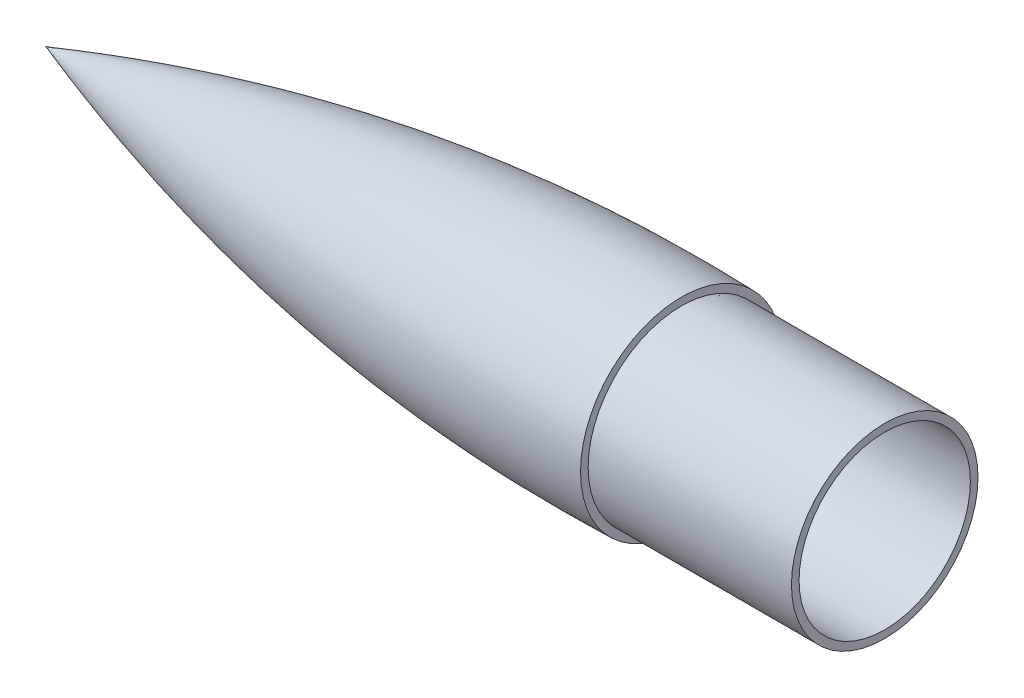
ISO-10303-21;
HEADER;
FILE_DESCRIPTION(('STEP AP214'),'2;1');
FILE_NAME('part.step','',(''),(''),'','','');
FILE_SCHEMA(('AUTOMOTIVE_DESIGN { 1 0 10303 214 1 1 1 1 }'));
ENDSEC;
DATA;
#1=APPLICATION_CONTEXT('core data for automotive mechanical design processes');
#2=APPLICATION_PROTOCOL_DEFINITION('international standard','automotive_design',2000,#1);
#3=PRODUCT_CONTEXT('',#1,'mechanical');
#4=PRODUCT('Part','Part','',(#3));
#5=PRODUCT_RELATED_PRODUCT_CATEGORY('part','',(#4));
#6=PRODUCT_DEFINITION_FORMATION('','',#4);
#7=PRODUCT_DEFINITION_CONTEXT('part definition',#1,'design');
#8=PRODUCT_DEFINITION('design','',#6,#7);
#9=PRODUCT_DEFINITION_SHAPE('','',#8);
#10=(LENGTH_UNIT() NAMED_UNIT(*) SI_UNIT(.MILLI.,.METRE.));
#11=(NAMED_UNIT(*) PLANE_ANGLE_UNIT() SI_UNIT($,.RADIAN.));
#12=(NAMED_UNIT(*) SI_UNIT($,.STERADIAN.) SOLID_ANGLE_UNIT());
#13=UNCERTAINTY_MEASURE_WITH_UNIT(LENGTH_MEASURE(1.E-05),#10,'distance_accuracy_value','');
#14=(GEOMETRIC_REPRESENTATION_CONTEXT(3) GLOBAL_UNCERTAINTY_ASSIGNED_CONTEXT((#13)) GLOBAL_UNIT_ASSIGNED_CONTEXT((#10,
#11,#12)) REPRESENTATION_CONTEXT('',''));
#15=CARTESIAN_POINT('',(0.,0.,0.));
#16=DIRECTION('',(0.,0.,1.));
#17=DIRECTION('',(1.,0.,0.));
#18=AXIS2_PLACEMENT_3D('',#15,#16,#17);
#19=CARTESIAN_POINT('',(250.000000000188,39.6996325000104,0.));
#20=CARTESIAN_POINT('',(125.000000000058,43.4661287500419,0.));
#21=CARTESIAN_POINT('',(-7.1803674117632E-11,-2.49557319254023E-11,0.));
#22=B_SPLINE_CURVE_WITH_KNOTS('',2,(#19,#20,#21),.UNSPECIFIED.,.F.,.F.,(3,3),
(0.0801802131822026,0.916380019380723),.UNSPECIFIED.);
#23=CARTESIAN_POINT('',(-5.7440163736544E-11,-1.9971871378921E-11,0.));
#24=DIRECTION('',(-1.,0.,0.));
#25=AXIS1_PLACEMENT('',#23,#24);
#26=SURFACE_OF_REVOLUTION('',#22,#25);
#27=CARTESIAN_POINT('',(0.999999999928185,0.,0.));
#28=DIRECTION('',(1.,0.,0.));
#29=DIRECTION('',(0.,0.,-1.));
#30=AXIS2_PLACEMENT_3D('',#27,#28,#29);
#31=CIRCLE('',#30,0.346973307995187);
#32=CARTESIAN_POINT('',(0.999999999928185,0.,-0.346973307995187));
#33=VERTEX_POINT('',#32);
#34=EDGE_CURVE('E88',#33,#33,#31,.T.);
#35=ORIENTED_EDGE('',*,*,#34,.T.);
#36=EDGE_LOOP('',(#35));
#37=FACE_BOUND('',#36,.T.);
#38=CARTESIAN_POINT('',(250.00000000017,-1.9971871378921E-11,0.));
#39=DIRECTION('',(-1.,0.,0.));
#40=DIRECTION('',(0.,0.,1.));
#41=AXIS2_PLACEMENT_3D('',#38,#39,#40);
#42=CIRCLE('',#41,39.6996325000309);
#43=CARTESIAN_POINT('',(250.00000000017,-1.9971871378921E-11,39.6996325000309));
#44=VERTEX_POINT('',#43);
#45=EDGE_CURVE('E91',#44,#44,#42,.T.);
#46=ORIENTED_EDGE('',*,*,#45,.T.);
#47=EDGE_LOOP('',(#46));
#48=FACE_BOUND('',#47,.T.);
#49=ADVANCED_FACE('F49',(#37,#48),#26,.T.);
#50=CARTESIAN_POINT('',(250.00000000017,-1.9971871378921E-11,0.));
#51=DIRECTION('',(-1.,0.,0.));
#52=DIRECTION('',(0.,0.,1.));
#53=AXIS2_PLACEMENT_3D('',#50,#51,#52);
#54=PLANE('',#53);
#55=CARTESIAN_POINT('',(250.00000000017,0.,0.));
#56=DIRECTION('',(-1.,0.,0.));
#57=DIRECTION('',(0.,0.,1.));
#58=AXIS2_PLACEMENT_3D('',#55,#56,#57);
#59=CIRCLE('',#58,36.699632500011);
#60=CARTESIAN_POINT('',(250.00000000017,0.,36.699632500011));
#61=VERTEX_POINT('',#60);
#62=EDGE_CURVE('E57',#61,#61,#59,.F.);
#63=ORIENTED_EDGE('',*,*,#62,.F.);
#64=EDGE_LOOP('',(#63));
#65=FACE_BOUND('',#64,.T.);
#66=ORIENTED_EDGE('',*,*,#45,.F.);
#67=EDGE_LOOP('',(#66));
#68=FACE_BOUND('',#67,.T.);
#69=ADVANCED_FACE('F77',(#65,#68),#54,.F.);
#70=CARTESIAN_POINT('',(0.,0.,0.));
#71=CARTESIAN_POINT('',(-0.0292424955705306,0.,0.0842788044332882));
#72=CARTESIAN_POINT('',(0.999999999928185,0.,0.346973307995187));
#73=B_SPLINE_CURVE_WITH_KNOTS('',2,(#70,#71,#72),.UNSPECIFIED.,.F.,.F.,(3,3),(0.,
0.514205833755612),.UNSPECIFIED.);
#74=CARTESIAN_POINT('',(0.999999999928185,0.,0.));
#75=DIRECTION('',(1.,0.,0.));
#76=AXIS1_PLACEMENT('',#74,#75);
#77=SURFACE_OF_REVOLUTION('',#73,#76);
#78=ORIENTED_EDGE('',*,*,#34,.F.);
#79=EDGE_LOOP('',(#78));
#80=FACE_BOUND('',#79,.T.);
#81=CARTESIAN_POINT('',(0.,0.,0.));
#82=VERTEX_POINT('',#81);
#83=VERTEX_LOOP('',#82);
#84=FACE_BOUND('',#83,.T.);
#85=ADVANCED_FACE('F83',(#80,#84),#77,.T.);
#86=CARTESIAN_POINT('',(330.00000000017,0.,0.));
#87=DIRECTION('',(1.,0.,0.));
#88=DIRECTION('',(0.,0.,-1.));
#89=AXIS2_PLACEMENT_3D('',#86,#87,#88);
#90=PLANE('',#89);
#91=CARTESIAN_POINT('',(330.00000000017,0.,0.));
#92=DIRECTION('',(1.,0.,0.));
#93=DIRECTION('',(0.,0.,-1.));
#94=AXIS2_PLACEMENT_3D('',#91,#92,#93);
#95=CIRCLE('',#94,36.699632500011);
#96=CARTESIAN_POINT('',(330.00000000017,0.,-36.699632500011));
#97=VERTEX_POINT('',#96);
#98=EDGE_CURVE('E95',#97,#97,#95,.T.);
#99=ORIENTED_EDGE('',*,*,#98,.T.);
#100=EDGE_LOOP('',(#99));
#101=FACE_BOUND('',#100,.T.);
#102=CARTESIAN_POINT('',(330.00000000017,0.,0.));
#103=DIRECTION('',(1.,0.,0.));
#104=DIRECTION('',(0.,0.,-1.));
#105=AXIS2_PLACEMENT_3D('',#102,#103,#104);
#106=CIRCLE('',#105,33.699632500011);
#107=CARTESIAN_POINT('',(330.00000000017,0.,-33.699632500011));
#108=VERTEX_POINT('',#107);
#109=EDGE_CURVE('E126',#108,#108,#106,.T.);
#110=ORIENTED_EDGE('',*,*,#109,.F.);
#111=EDGE_LOOP('',(#110));
#112=FACE_BOUND('',#111,.T.);
#113=ADVANCED_FACE('F114',(#101,#112),#90,.T.);
#114=CARTESIAN_POINT('',(330.00000000017,0.,0.));
#115=DIRECTION('',(-1.,0.,0.));
#116=DIRECTION('',(0.,0.,1.));
#117=AXIS2_PLACEMENT_3D('',#114,#115,#116);
#118=CYLINDRICAL_SURFACE('',#117,36.699632500011);
#119=ORIENTED_EDGE('',*,*,#98,.F.);
#120=EDGE_LOOP('',(#119));
#121=FACE_BOUND('',#120,.T.);
#122=ORIENTED_EDGE('',*,*,#62,.T.);
#123=EDGE_LOOP('',(#122));
#124=FACE_BOUND('',#123,.T.);
#125=ADVANCED_FACE('F71',(#121,#124),#118,.T.);
#126=CARTESIAN_POINT('',(330.00000000017,0.,0.));
#127=DIRECTION('',(-1.,0.,0.));
#128=DIRECTION('',(0.,0.,1.));
#129=AXIS2_PLACEMENT_3D('',#126,#127,#128);
#130=CYLINDRICAL_SURFACE('',#129,33.699632500011);
#131=ORIENTED_EDGE('',*,*,#109,.T.);
#132=EDGE_LOOP('',(#131));
#133=FACE_BOUND('',#132,.T.);
#134=CARTESIAN_POINT('',(164.129298268943,-1.9971871378921E-11,0.));
#135=DIRECTION('',(-1.,0.,0.));
#136=DIRECTION('',(0.,0.,1.));
#137=AXIS2_PLACEMENT_3D('',#134,#135,#136);
#138=CIRCLE('',#137,33.699632499991);
#139=CARTESIAN_POINT('',(164.129298268943,-1.9971871378921E-11,33.699632499991));
#140=VERTEX_POINT('',#139);
#141=EDGE_CURVE('E12',#140,#140,#138,.T.);
#142=ORIENTED_EDGE('',*,*,#141,.T.);
#143=EDGE_LOOP('',(#142));
#144=FACE_BOUND('',#143,.T.);
#145=ADVANCED_FACE('F65',(#133,#144),#130,.F.);
#146=CARTESIAN_POINT('',(250.000000000188,39.6996325000104,0.));
#147=CARTESIAN_POINT('',(129.165541311908,43.3406127841985,0.));
#148=CARTESIAN_POINT('',(8.33108262362896,2.84450692980619,0.));
#149=B_SPLINE_CURVE_WITH_KNOTS('',2,(#146,#147,#148),.UNSPECIFIED.,.F.,.F.,(3,3),
(0.0801802131822026,0.888514220679303),.UNSPECIFIED.);
#150=CARTESIAN_POINT('',(-5.7440163736544E-11,-1.9971871378921E-11,0.));
#151=DIRECTION('',(-1.,0.,0.));
#152=AXIS1_PLACEMENT('',#150,#151);
#153=SURFACE_OF_REVOLUTION('',#149,#152);
#154=OFFSET_SURFACE('',#153,-3.,.F.);
#155=ORIENTED_EDGE('',*,*,#141,.F.);
#156=EDGE_LOOP('',(#155));
#157=FACE_BOUND('',#156,.T.);
#158=CARTESIAN_POINT('',(9.28438232790417,-1.99246001642006E-11,0.));
#159=VERTEX_POINT('',#158);
#160=VERTEX_LOOP('',#159);
#161=FACE_BOUND('',#160,.T.);
#162=ADVANCED_FACE('F63',(#157,#161),#154,.F.);
#163=CLOSED_SHELL('',(#49,#69,#85,#113,#125,#145,#162));
#164=MANIFOLD_SOLID_BREP('B2',#163);
#165=ADVANCED_BREP_SHAPE_REPRESENTATION('',(#18,#164),#14);
#166=SHAPE_DEFINITION_REPRESENTATION(#9,#165);
ENDSEC;
END-ISO-10303-21;
